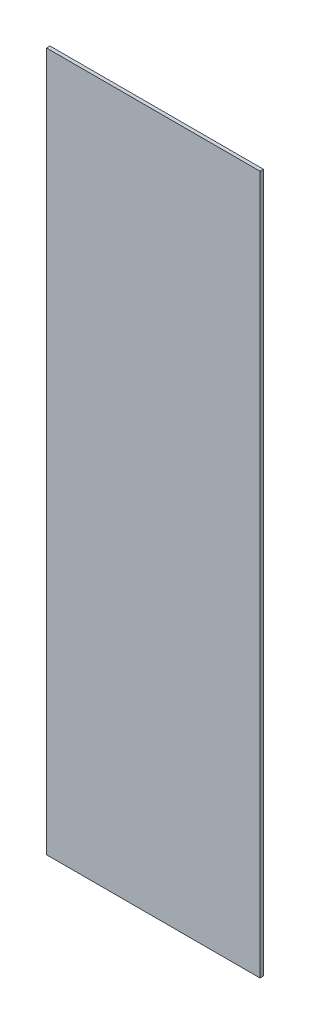
ISO-10303-21;
HEADER;
FILE_DESCRIPTION(('STEP AP214'),'2;1');
FILE_NAME('part.step','',(''),(''),'','','');
FILE_SCHEMA(('AUTOMOTIVE_DESIGN { 1 0 10303 214 1 1 1 1 }'));
ENDSEC;
DATA;
#1=APPLICATION_CONTEXT('core data for automotive mechanical design processes');
#2=APPLICATION_PROTOCOL_DEFINITION('international standard','automotive_design',2000,#1);
#3=PRODUCT_CONTEXT('',#1,'mechanical');
#4=PRODUCT('Part','Part','',(#3));
#5=PRODUCT_RELATED_PRODUCT_CATEGORY('part','',(#4));
#6=PRODUCT_DEFINITION_FORMATION('','',#4);
#7=PRODUCT_DEFINITION_CONTEXT('part definition',#1,'design');
#8=PRODUCT_DEFINITION('design','',#6,#7);
#9=PRODUCT_DEFINITION_SHAPE('','',#8);
#10=(LENGTH_UNIT() NAMED_UNIT(*) SI_UNIT(.MILLI.,.METRE.));
#11=(NAMED_UNIT(*) PLANE_ANGLE_UNIT() SI_UNIT($,.RADIAN.));
#12=(NAMED_UNIT(*) SI_UNIT($,.STERADIAN.) SOLID_ANGLE_UNIT());
#13=UNCERTAINTY_MEASURE_WITH_UNIT(LENGTH_MEASURE(1.E-05),#10,'distance_accuracy_value','');
#14=(GEOMETRIC_REPRESENTATION_CONTEXT(3) GLOBAL_UNCERTAINTY_ASSIGNED_CONTEXT((#13)) GLOBAL_UNIT_ASSIGNED_CONTEXT((#10,
#11,#12)) REPRESENTATION_CONTEXT('',''));
#15=CARTESIAN_POINT('',(0.,0.,0.));
#16=DIRECTION('',(0.,0.,1.));
#17=DIRECTION('',(1.,0.,0.));
#18=AXIS2_PLACEMENT_3D('',#15,#16,#17);
#19=CARTESIAN_POINT('',(62.,203.,2.));
#20=DIRECTION('',(-1.,0.,0.));
#21=DIRECTION('',(0.,-1.,0.));
#22=AXIS2_PLACEMENT_3D('',#19,#20,#21);
#23=PLANE('',#22);
#24=DIRECTION('',(0.,1.,0.));
#25=VECTOR('',#24,1.);
#26=CARTESIAN_POINT('',(62.,203.,0.));
#27=LINE('',#26,#25);
#28=CARTESIAN_POINT('',(62.,-203.,0.));
#29=VERTEX_POINT('',#28);
#30=CARTESIAN_POINT('',(62.,203.,0.));
#31=VERTEX_POINT('',#30);
#32=EDGE_CURVE('E98',#29,#31,#27,.T.);
#33=ORIENTED_EDGE('',*,*,#32,.T.);
#34=DIRECTION('',(0.,0.,-1.));
#35=VECTOR('',#34,1.);
#36=CARTESIAN_POINT('',(62.,203.,2.));
#37=LINE('',#36,#35);
#38=CARTESIAN_POINT('',(62.,203.,2.));
#39=VERTEX_POINT('',#38);
#40=EDGE_CURVE('E11',#39,#31,#37,.T.);
#41=ORIENTED_EDGE('',*,*,#40,.F.);
#42=DIRECTION('',(0.,1.,0.));
#43=VECTOR('',#42,1.);
#44=CARTESIAN_POINT('',(62.,203.,2.));
#45=LINE('',#44,#43);
#46=CARTESIAN_POINT('',(62.,-203.,2.));
#47=VERTEX_POINT('',#46);
#48=EDGE_CURVE('E86',#47,#39,#45,.T.);
#49=ORIENTED_EDGE('',*,*,#48,.F.);
#50=DIRECTION('',(0.,0.,-1.));
#51=VECTOR('',#50,1.);
#52=CARTESIAN_POINT('',(62.,-203.,2.));
#53=LINE('',#52,#51);
#54=EDGE_CURVE('E94',#47,#29,#53,.T.);
#55=ORIENTED_EDGE('',*,*,#54,.T.);
#56=EDGE_LOOP('',(#33,#41,#49,#55));
#57=FACE_BOUND('',#56,.T.);
#58=ADVANCED_FACE('F35',(#57),#23,.F.);
#59=CARTESIAN_POINT('',(-62.,203.,2.));
#60=DIRECTION('',(0.,-1.,0.));
#61=DIRECTION('',(0.,0.,-1.));
#62=AXIS2_PLACEMENT_3D('',#59,#60,#61);
#63=PLANE('',#62);
#64=DIRECTION('',(-1.,0.,0.));
#65=VECTOR('',#64,1.);
#66=CARTESIAN_POINT('',(-62.,203.,0.));
#67=LINE('',#66,#65);
#68=CARTESIAN_POINT('',(-62.,203.,0.));
#69=VERTEX_POINT('',#68);
#70=EDGE_CURVE('E90',#31,#69,#67,.T.);
#71=ORIENTED_EDGE('',*,*,#70,.T.);
#72=DIRECTION('',(0.,0.,-1.));
#73=VECTOR('',#72,1.);
#74=CARTESIAN_POINT('',(-62.,203.,2.));
#75=LINE('',#74,#73);
#76=CARTESIAN_POINT('',(-62.,203.,2.));
#77=VERTEX_POINT('',#76);
#78=EDGE_CURVE('E43',#77,#69,#75,.T.);
#79=ORIENTED_EDGE('',*,*,#78,.F.);
#80=DIRECTION('',(-1.,0.,0.));
#81=VECTOR('',#80,1.);
#82=CARTESIAN_POINT('',(-62.,203.,2.));
#83=LINE('',#82,#81);
#84=EDGE_CURVE('E81',#39,#77,#83,.T.);
#85=ORIENTED_EDGE('',*,*,#84,.F.);
#86=ORIENTED_EDGE('',*,*,#40,.T.);
#87=EDGE_LOOP('',(#71,#79,#85,#86));
#88=FACE_BOUND('',#87,.T.);
#89=ADVANCED_FACE('F89',(#88),#63,.F.);
#90=CARTESIAN_POINT('',(-62.,203.,2.));
#91=DIRECTION('',(1.,0.,0.));
#92=DIRECTION('',(0.,1.,0.));
#93=AXIS2_PLACEMENT_3D('',#90,#91,#92);
#94=PLANE('',#93);
#95=DIRECTION('',(0.,-1.,0.));
#96=VECTOR('',#95,1.);
#97=CARTESIAN_POINT('',(-62.,203.,0.));
#98=LINE('',#97,#96);
#99=CARTESIAN_POINT('',(-62.,-203.,0.));
#100=VERTEX_POINT('',#99);
#101=EDGE_CURVE('E68',#69,#100,#98,.T.);
#102=ORIENTED_EDGE('',*,*,#101,.T.);
#103=DIRECTION('',(0.,0.,-1.));
#104=VECTOR('',#103,1.);
#105=CARTESIAN_POINT('',(-62.,-203.,2.));
#106=LINE('',#105,#104);
#107=CARTESIAN_POINT('',(-62.,-203.,2.));
#108=VERTEX_POINT('',#107);
#109=EDGE_CURVE('E91',#108,#100,#106,.T.);
#110=ORIENTED_EDGE('',*,*,#109,.F.);
#111=DIRECTION('',(0.,-1.,0.));
#112=VECTOR('',#111,1.);
#113=CARTESIAN_POINT('',(-62.,203.,2.));
#114=LINE('',#113,#112);
#115=EDGE_CURVE('E84',#77,#108,#114,.T.);
#116=ORIENTED_EDGE('',*,*,#115,.F.);
#117=ORIENTED_EDGE('',*,*,#78,.T.);
#118=EDGE_LOOP('',(#102,#110,#116,#117));
#119=FACE_BOUND('',#118,.T.);
#120=ADVANCED_FACE('F92',(#119),#94,.F.);
#121=CARTESIAN_POINT('',(-62.,-203.,2.));
#122=DIRECTION('',(0.,1.,0.));
#123=DIRECTION('',(0.,0.,1.));
#124=AXIS2_PLACEMENT_3D('',#121,#122,#123);
#125=PLANE('',#124);
#126=DIRECTION('',(1.,0.,0.));
#127=VECTOR('',#126,1.);
#128=CARTESIAN_POINT('',(-62.,-203.,0.));
#129=LINE('',#128,#127);
#130=EDGE_CURVE('E74',#100,#29,#129,.T.);
#131=ORIENTED_EDGE('',*,*,#130,.T.);
#132=ORIENTED_EDGE('',*,*,#54,.F.);
#133=DIRECTION('',(1.,0.,0.));
#134=VECTOR('',#133,1.);
#135=CARTESIAN_POINT('',(-62.,-203.,2.));
#136=LINE('',#135,#134);
#137=EDGE_CURVE('E51',#108,#47,#136,.T.);
#138=ORIENTED_EDGE('',*,*,#137,.F.);
#139=ORIENTED_EDGE('',*,*,#109,.T.);
#140=EDGE_LOOP('',(#131,#132,#138,#139));
#141=FACE_BOUND('',#140,.T.);
#142=ADVANCED_FACE('F105',(#141),#125,.F.);
#143=CARTESIAN_POINT('',(0.,0.,2.));
#144=DIRECTION('',(0.,0.,1.));
#145=DIRECTION('',(1.,0.,0.));
#146=AXIS2_PLACEMENT_3D('',#143,#144,#145);
#147=PLANE('',#146);
#148=ORIENTED_EDGE('',*,*,#48,.T.);
#149=ORIENTED_EDGE('',*,*,#84,.T.);
#150=ORIENTED_EDGE('',*,*,#115,.T.);
#151=ORIENTED_EDGE('',*,*,#137,.T.);
#152=EDGE_LOOP('',(#148,#149,#150,#151));
#153=FACE_BOUND('',#152,.T.);
#154=ADVANCED_FACE('F82',(#153),#147,.T.);
#155=CARTESIAN_POINT('',(0.,0.,0.));
#156=DIRECTION('',(0.,0.,1.));
#157=DIRECTION('',(1.,0.,0.));
#158=AXIS2_PLACEMENT_3D('',#155,#156,#157);
#159=PLANE('',#158);
#160=ORIENTED_EDGE('',*,*,#32,.F.);
#161=ORIENTED_EDGE('',*,*,#130,.F.);
#162=ORIENTED_EDGE('',*,*,#101,.F.);
#163=ORIENTED_EDGE('',*,*,#70,.F.);
#164=EDGE_LOOP('',(#160,#161,#162,#163));
#165=FACE_BOUND('',#164,.T.);
#166=ADVANCED_FACE('F108',(#165),#159,.F.);
#167=CLOSED_SHELL('',(#58,#89,#120,#142,#154,#166));
#168=MANIFOLD_SOLID_BREP('B2',#167);
#169=ADVANCED_BREP_SHAPE_REPRESENTATION('',(#18,#168),#14);
#170=SHAPE_DEFINITION_REPRESENTATION(#9,#169);
ENDSEC;
END-ISO-10303-21;
